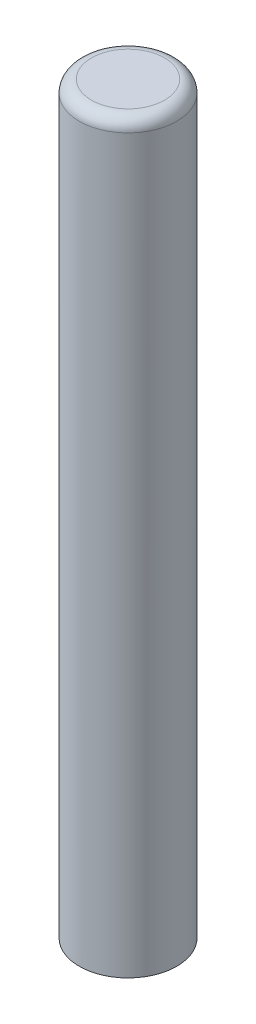
ISO-10303-21;
HEADER;
FILE_DESCRIPTION(('STEP AP214'),'2;1');
FILE_NAME('part.step','',(''),(''),'','','');
FILE_SCHEMA(('AUTOMOTIVE_DESIGN { 1 0 10303 214 1 1 1 1 }'));
ENDSEC;
DATA;
#1=APPLICATION_CONTEXT('core data for automotive mechanical design processes');
#2=APPLICATION_PROTOCOL_DEFINITION('international standard','automotive_design',2000,#1);
#3=PRODUCT_CONTEXT('',#1,'mechanical');
#4=PRODUCT('Part','Part','',(#3));
#5=PRODUCT_RELATED_PRODUCT_CATEGORY('part','',(#4));
#6=PRODUCT_DEFINITION_FORMATION('','',#4);
#7=PRODUCT_DEFINITION_CONTEXT('part definition',#1,'design');
#8=PRODUCT_DEFINITION('design','',#6,#7);
#9=PRODUCT_DEFINITION_SHAPE('','',#8);
#10=(LENGTH_UNIT() NAMED_UNIT(*) SI_UNIT(.MILLI.,.METRE.));
#11=(NAMED_UNIT(*) PLANE_ANGLE_UNIT() SI_UNIT($,.RADIAN.));
#12=(NAMED_UNIT(*) SI_UNIT($,.STERADIAN.) SOLID_ANGLE_UNIT());
#13=UNCERTAINTY_MEASURE_WITH_UNIT(LENGTH_MEASURE(1.E-05),#10,'distance_accuracy_value','');
#14=(GEOMETRIC_REPRESENTATION_CONTEXT(3) GLOBAL_UNCERTAINTY_ASSIGNED_CONTEXT((#13)) GLOBAL_UNIT_ASSIGNED_CONTEXT((#10,
#11,#12)) REPRESENTATION_CONTEXT('',''));
#15=CARTESIAN_POINT('',(0.,0.,0.));
#16=DIRECTION('',(0.,0.,1.));
#17=DIRECTION('',(1.,0.,0.));
#18=AXIS2_PLACEMENT_3D('',#15,#16,#17);
#19=CARTESIAN_POINT('',(4.00000000000001,0.,0.));
#20=DIRECTION('',(0.,-1.,0.));
#21=DIRECTION('',(0.,0.,-1.));
#22=AXIS2_PLACEMENT_3D('',#19,#20,#21);
#23=PLANE('',#22);
#24=CARTESIAN_POINT('',(0.,0.,0.));
#25=DIRECTION('',(0.,-1.,0.));
#26=DIRECTION('',(0.,0.,-1.));
#27=AXIS2_PLACEMENT_3D('',#24,#25,#26);
#28=CIRCLE('',#27,4.00000000000001);
#29=CARTESIAN_POINT('',(0.,0.,-4.00000000000001));
#30=VERTEX_POINT('',#29);
#31=EDGE_CURVE('E54',#30,#30,#28,.T.);
#32=ORIENTED_EDGE('',*,*,#31,.T.);
#33=EDGE_LOOP('',(#32));
#34=FACE_BOUND('',#33,.T.);
#35=ADVANCED_FACE('F43',(#34),#23,.T.);
#36=CARTESIAN_POINT('',(0.,0.,0.));
#37=DIRECTION('',(0.,-1.,0.));
#38=DIRECTION('',(0.,0.,-1.));
#39=AXIS2_PLACEMENT_3D('',#36,#37,#38);
#40=CYLINDRICAL_SURFACE('',#39,4.00000000000001);
#41=CARTESIAN_POINT('',(0.,60.,0.));
#42=DIRECTION('',(0.,1.,0.));
#43=DIRECTION('',(0.,0.,1.));
#44=AXIS2_PLACEMENT_3D('',#41,#42,#43);
#45=CIRCLE('',#44,4.00000000000001);
#46=CARTESIAN_POINT('',(0.,60.,4.00000000000001));
#47=VERTEX_POINT('',#46);
#48=EDGE_CURVE('E50',#47,#47,#45,.F.);
#49=ORIENTED_EDGE('',*,*,#48,.T.);
#50=EDGE_LOOP('',(#49));
#51=FACE_BOUND('',#50,.T.);
#52=ORIENTED_EDGE('',*,*,#31,.F.);
#53=EDGE_LOOP('',(#52));
#54=FACE_BOUND('',#53,.T.);
#55=ADVANCED_FACE('F62',(#51,#54),#40,.T.);
#56=CARTESIAN_POINT('',(4.,61.,0.));
#57=DIRECTION('',(0.,1.,0.));
#58=DIRECTION('',(0.,0.,1.));
#59=AXIS2_PLACEMENT_3D('',#56,#57,#58);
#60=PLANE('',#59);
#61=CARTESIAN_POINT('',(0.,61.,0.));
#62=DIRECTION('',(0.,1.,0.));
#63=DIRECTION('',(0.,0.,1.));
#64=AXIS2_PLACEMENT_3D('',#61,#62,#63);
#65=CIRCLE('',#64,3.00000000000001);
#66=CARTESIAN_POINT('',(0.,61.,3.00000000000001));
#67=VERTEX_POINT('',#66);
#68=EDGE_CURVE('E10',#67,#67,#65,.T.);
#69=ORIENTED_EDGE('',*,*,#68,.T.);
#70=EDGE_LOOP('',(#69));
#71=FACE_BOUND('',#70,.T.);
#72=ADVANCED_FACE('F64',(#71),#60,.T.);
#73=CARTESIAN_POINT('',(0.,60.,0.));
#74=DIRECTION('',(0.,1.,0.));
#75=DIRECTION('',(0.,0.,1.));
#76=AXIS2_PLACEMENT_3D('',#73,#74,#75);
#77=TOROIDAL_SURFACE('',#76,3.00000000000001,1.);
#78=ORIENTED_EDGE('',*,*,#68,.F.);
#79=EDGE_LOOP('',(#78));
#80=FACE_BOUND('',#79,.T.);
#81=ORIENTED_EDGE('',*,*,#48,.F.);
#82=EDGE_LOOP('',(#81));
#83=FACE_BOUND('',#82,.T.);
#84=ADVANCED_FACE('F45',(#80,#83),#77,.T.);
#85=CLOSED_SHELL('',(#35,#55,#72,#84));
#86=MANIFOLD_SOLID_BREP('B2',#85);
#87=ADVANCED_BREP_SHAPE_REPRESENTATION('',(#18,#86),#14);
#88=SHAPE_DEFINITION_REPRESENTATION(#9,#87);
ENDSEC;
END-ISO-10303-21;
